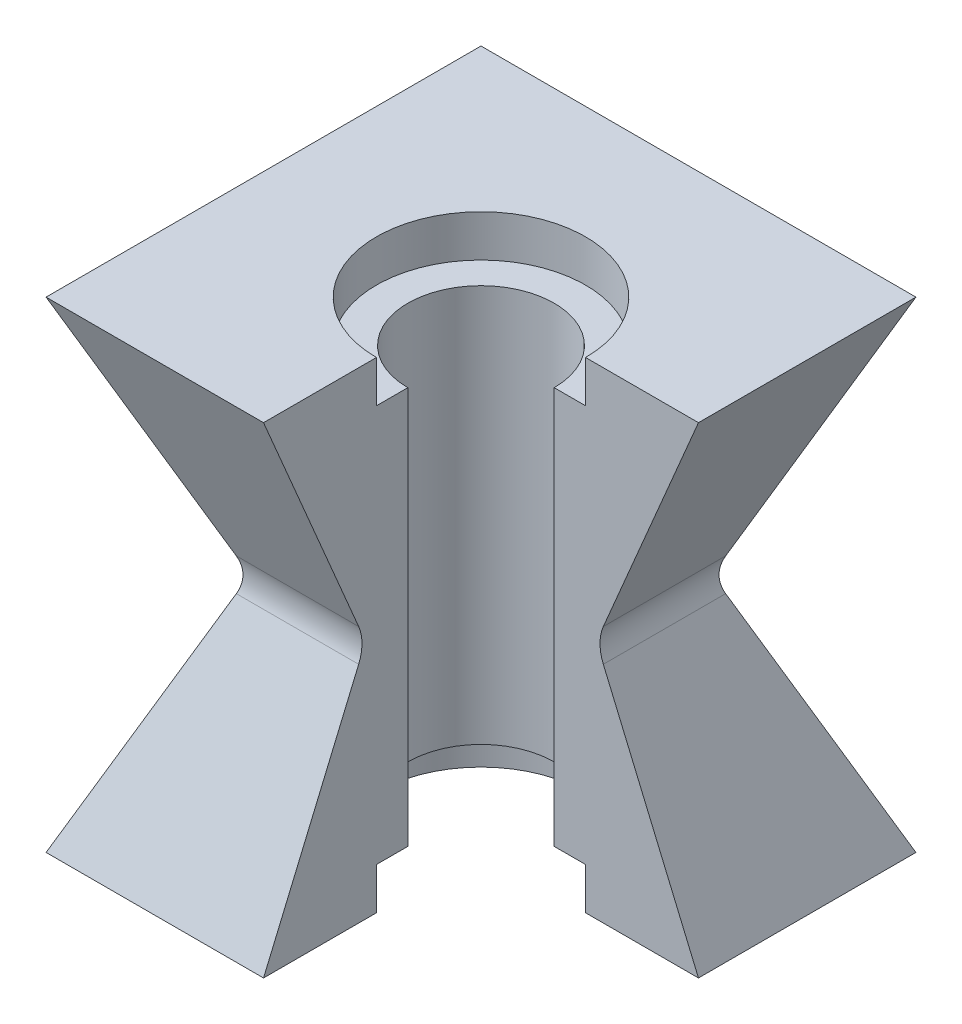
ISO-10303-21;
HEADER;
FILE_DESCRIPTION(('STEP AP214'),'2;1');
FILE_NAME('part.step','',(''),(''),'','','');
FILE_SCHEMA(('AUTOMOTIVE_DESIGN { 1 0 10303 214 1 1 1 1 }'));
ENDSEC;
DATA;
#1=APPLICATION_CONTEXT('core data for automotive mechanical design processes');
#2=APPLICATION_PROTOCOL_DEFINITION('international standard','automotive_design',2000,#1);
#3=PRODUCT_CONTEXT('',#1,'mechanical');
#4=PRODUCT('Part','Part','',(#3));
#5=PRODUCT_RELATED_PRODUCT_CATEGORY('part','',(#4));
#6=PRODUCT_DEFINITION_FORMATION('','',#4);
#7=PRODUCT_DEFINITION_CONTEXT('part definition',#1,'design');
#8=PRODUCT_DEFINITION('design','',#6,#7);
#9=PRODUCT_DEFINITION_SHAPE('','',#8);
#10=(LENGTH_UNIT() NAMED_UNIT(*) SI_UNIT(.MILLI.,.METRE.));
#11=(NAMED_UNIT(*) PLANE_ANGLE_UNIT() SI_UNIT($,.RADIAN.));
#12=(NAMED_UNIT(*) SI_UNIT($,.STERADIAN.) SOLID_ANGLE_UNIT());
#13=UNCERTAINTY_MEASURE_WITH_UNIT(LENGTH_MEASURE(1.E-05),#10,'distance_accuracy_value','');
#14=(GEOMETRIC_REPRESENTATION_CONTEXT(3) GLOBAL_UNCERTAINTY_ASSIGNED_CONTEXT((#13)) GLOBAL_UNIT_ASSIGNED_CONTEXT((#10,
#11,#12)) REPRESENTATION_CONTEXT('',''));
#15=CARTESIAN_POINT('',(0.,0.,0.));
#16=DIRECTION('',(0.,0.,1.));
#17=DIRECTION('',(1.,0.,0.));
#18=AXIS2_PLACEMENT_3D('',#15,#16,#17);
#19=CARTESIAN_POINT('',(0.,57.5,-13.5436981579994));
#20=DIRECTION('',(-1.,0.,0.));
#21=DIRECTION('',(0.,0.,1.));
#22=AXIS2_PLACEMENT_3D('',#19,#20,#21);
#23=CYLINDRICAL_SURFACE('',#22,10.);
#24=DIRECTION('',(-1.,0.,0.));
#25=VECTOR('',#24,1.);
#26=CARTESIAN_POINT('',(0.,61.4073112848927,-22.7487466925238));
#27=LINE('',#26,#25);
#28=CARTESIAN_POINT('',(22.7487466925238,61.4073112848927,-22.7487466925238));
#29=VERTEX_POINT('',#28);
#30=CARTESIAN_POINT('',(52.,61.4073112848927,-22.7487466925238));
#31=VERTEX_POINT('',#30);
#32=EDGE_CURVE('E253',#29,#31,#27,.F.);
#33=ORIENTED_EDGE('',*,*,#32,.F.);
#34=CARTESIAN_POINT('',(13.5436981579994,57.5,-13.5436981579994));
#35=DIRECTION('',(-0.707106781186548,0.,-0.707106781186547));
#36=DIRECTION('',(0.707106781186547,0.,-0.707106781186548));
#37=AXIS2_PLACEMENT_3D('',#34,#35,#36);
#38=ELLIPSE('',#37,14.1421356237309,10.);
#39=CARTESIAN_POINT('',(22.7487466925238,53.5926887151073,-22.7487466925238));
#40=VERTEX_POINT('',#39);
#41=EDGE_CURVE('E50',#29,#40,#38,.T.);
#42=ORIENTED_EDGE('',*,*,#41,.T.);
#43=DIRECTION('',(-1.,0.,0.));
#44=VECTOR('',#43,1.);
#45=CARTESIAN_POINT('',(0.,53.5926887151073,-22.7487466925238));
#46=LINE('',#45,#44);
#47=CARTESIAN_POINT('',(52.,53.5926887151073,-22.7487466925238));
#48=VERTEX_POINT('',#47);
#49=EDGE_CURVE('E257',#48,#40,#46,.T.);
#50=ORIENTED_EDGE('',*,*,#49,.F.);
#51=CARTESIAN_POINT('',(52.,57.5,-13.5436981579994));
#52=DIRECTION('',(-1.,0.,0.));
#53=DIRECTION('',(0.,0.,1.));
#54=AXIS2_PLACEMENT_3D('',#51,#52,#53);
#55=CIRCLE('',#54,10.);
#56=EDGE_CURVE('E11',#48,#31,#55,.F.);
#57=ORIENTED_EDGE('',*,*,#56,.T.);
#58=EDGE_LOOP('',(#33,#42,#50,#57));
#59=FACE_BOUND('',#58,.T.);
#60=ADVANCED_FACE('F42',(#59),#23,.F.);
#61=CARTESIAN_POINT('',(13.5436981579994,57.5,0.));
#62=DIRECTION('',(0.,0.,-1.));
#63=DIRECTION('',(-1.,0.,0.));
#64=AXIS2_PLACEMENT_3D('',#61,#62,#63);
#65=CYLINDRICAL_SURFACE('',#64,10.);
#66=DIRECTION('',(0.,0.,-1.));
#67=VECTOR('',#66,1.);
#68=CARTESIAN_POINT('',(22.7487466925238,61.4073112848927,0.));
#69=LINE('',#68,#67);
#70=CARTESIAN_POINT('',(22.7487466925237,61.4073112848928,-81.2512533074762));
#71=VERTEX_POINT('',#70);
#72=EDGE_CURVE('E244',#71,#29,#69,.F.);
#73=ORIENTED_EDGE('',*,*,#72,.F.);
#74=CARTESIAN_POINT('',(13.5436981579994,57.5,-90.4563018420006));
#75=DIRECTION('',(0.707106781186547,0.,-0.707106781186548));
#76=DIRECTION('',(0.707106781186548,0.,0.707106781186547));
#77=AXIS2_PLACEMENT_3D('',#74,#75,#76);
#78=ELLIPSE('',#77,14.142135623731,10.);
#79=CARTESIAN_POINT('',(22.7487466925238,53.5926887151073,-81.2512533074762));
#80=VERTEX_POINT('',#79);
#81=EDGE_CURVE('E250',#71,#80,#78,.T.);
#82=ORIENTED_EDGE('',*,*,#81,.T.);
#83=DIRECTION('',(0.,0.,-1.));
#84=VECTOR('',#83,1.);
#85=CARTESIAN_POINT('',(22.7487466925238,53.5926887151073,0.));
#86=LINE('',#85,#84);
#87=EDGE_CURVE('E57',#40,#80,#86,.T.);
#88=ORIENTED_EDGE('',*,*,#87,.F.);
#89=ORIENTED_EDGE('',*,*,#41,.F.);
#90=EDGE_LOOP('',(#73,#82,#88,#89));
#91=FACE_BOUND('',#90,.T.);
#92=ADVANCED_FACE('F407',(#91),#65,.F.);
#93=CARTESIAN_POINT('',(0.,57.5,-90.4563018420006));
#94=DIRECTION('',(1.,0.,0.));
#95=DIRECTION('',(0.,0.,-1.));
#96=AXIS2_PLACEMENT_3D('',#93,#94,#95);
#97=CYLINDRICAL_SURFACE('',#96,10.);
#98=DIRECTION('',(1.,0.,0.));
#99=VECTOR('',#98,1.);
#100=CARTESIAN_POINT('',(0.,61.4073112848927,-81.2512533074762));
#101=LINE('',#100,#99);
#102=CARTESIAN_POINT('',(81.2512533074762,61.4073112848928,-81.2512533074762));
#103=VERTEX_POINT('',#102);
#104=EDGE_CURVE('E232',#103,#71,#101,.F.);
#105=ORIENTED_EDGE('',*,*,#104,.F.);
#106=CARTESIAN_POINT('',(90.4563018420006,57.5,-90.4563018420006));
#107=DIRECTION('',(0.707106781186548,0.,0.707106781186547));
#108=DIRECTION('',(-0.707106781186547,0.,0.707106781186548));
#109=AXIS2_PLACEMENT_3D('',#106,#107,#108);
#110=ELLIPSE('',#109,14.1421356237309,10.);
#111=CARTESIAN_POINT('',(81.2512533074762,53.5926887151073,-81.2512533074762));
#112=VERTEX_POINT('',#111);
#113=EDGE_CURVE('E240',#103,#112,#110,.T.);
#114=ORIENTED_EDGE('',*,*,#113,.T.);
#115=DIRECTION('',(1.,0.,0.));
#116=VECTOR('',#115,1.);
#117=CARTESIAN_POINT('',(0.,53.5926887151073,-81.2512533074762));
#118=LINE('',#117,#116);
#119=EDGE_CURVE('E236',#80,#112,#118,.T.);
#120=ORIENTED_EDGE('',*,*,#119,.F.);
#121=ORIENTED_EDGE('',*,*,#81,.F.);
#122=EDGE_LOOP('',(#105,#114,#120,#121));
#123=FACE_BOUND('',#122,.T.);
#124=ADVANCED_FACE('F411',(#123),#97,.F.);
#125=CARTESIAN_POINT('',(90.4563018420006,57.5,0.));
#126=DIRECTION('',(0.,0.,1.));
#127=DIRECTION('',(1.,0.,0.));
#128=AXIS2_PLACEMENT_3D('',#125,#126,#127);
#129=CYLINDRICAL_SURFACE('',#128,10.);
#130=DIRECTION('',(0.,0.,1.));
#131=VECTOR('',#130,1.);
#132=CARTESIAN_POINT('',(81.2512533074762,61.4073112848927,0.));
#133=LINE('',#132,#131);
#134=CARTESIAN_POINT('',(81.2512533074762,61.4073112848927,-52.));
#135=VERTEX_POINT('',#134);
#136=EDGE_CURVE('E221',#135,#103,#133,.F.);
#137=ORIENTED_EDGE('',*,*,#136,.F.);
#138=CARTESIAN_POINT('',(90.4563018420006,57.5,-52.));
#139=DIRECTION('',(0.,0.,-1.));
#140=DIRECTION('',(-1.,0.,0.));
#141=AXIS2_PLACEMENT_3D('',#138,#139,#140);
#142=CIRCLE('',#141,10.);
#143=CARTESIAN_POINT('',(81.2512533074762,53.5926887151073,-52.));
#144=VERTEX_POINT('',#143);
#145=EDGE_CURVE('E229',#135,#144,#142,.F.);
#146=ORIENTED_EDGE('',*,*,#145,.T.);
#147=DIRECTION('',(0.,0.,1.));
#148=VECTOR('',#147,1.);
#149=CARTESIAN_POINT('',(81.2512533074762,53.5926887151073,0.));
#150=LINE('',#149,#148);
#151=EDGE_CURVE('E225',#112,#144,#150,.T.);
#152=ORIENTED_EDGE('',*,*,#151,.F.);
#153=ORIENTED_EDGE('',*,*,#113,.F.);
#154=EDGE_LOOP('',(#137,#146,#152,#153));
#155=FACE_BOUND('',#154,.T.);
#156=ADVANCED_FACE('F415',(#155),#129,.F.);
#157=CARTESIAN_POINT('',(52.,0.,-52.));
#158=DIRECTION('',(0.,1.,0.));
#159=DIRECTION('',(0.,0.,1.));
#160=AXIS2_PLACEMENT_3D('',#157,#158,#159);
#161=CYLINDRICAL_SURFACE('',#160,17.5);
#162=CARTESIAN_POINT('',(52.,105.,-52.));
#163=DIRECTION('',(0.,1.,0.));
#164=DIRECTION('',(0.,0.,1.));
#165=AXIS2_PLACEMENT_3D('',#162,#163,#164);
#166=CIRCLE('',#165,17.5);
#167=CARTESIAN_POINT('',(69.5,105.,-52.));
#168=VERTEX_POINT('',#167);
#169=CARTESIAN_POINT('',(52.,105.,-34.5));
#170=VERTEX_POINT('',#169);
#171=EDGE_CURVE('E205',#168,#170,#166,.T.);
#172=ORIENTED_EDGE('',*,*,#171,.T.);
#173=DIRECTION('',(0.,1.,0.));
#174=VECTOR('',#173,1.);
#175=CARTESIAN_POINT('',(52.,0.,-34.5));
#176=LINE('',#175,#174);
#177=CARTESIAN_POINT('',(52.,10.,-34.5));
#178=VERTEX_POINT('',#177);
#179=EDGE_CURVE('E310',#170,#178,#176,.F.);
#180=ORIENTED_EDGE('',*,*,#179,.T.);
#181=CARTESIAN_POINT('',(52.,10.,-52.));
#182=DIRECTION('',(0.,-1.,0.));
#183=DIRECTION('',(0.,0.,-1.));
#184=AXIS2_PLACEMENT_3D('',#181,#182,#183);
#185=CIRCLE('',#184,17.5);
#186=CARTESIAN_POINT('',(69.5,10.,-52.));
#187=VERTEX_POINT('',#186);
#188=EDGE_CURVE('E210',#187,#178,#185,.F.);
#189=ORIENTED_EDGE('',*,*,#188,.F.);
#190=DIRECTION('',(0.,1.,0.));
#191=VECTOR('',#190,1.);
#192=CARTESIAN_POINT('',(69.5,0.,-52.));
#193=LINE('',#192,#191);
#194=EDGE_CURVE('E286',#187,#168,#193,.T.);
#195=ORIENTED_EDGE('',*,*,#194,.T.);
#196=EDGE_LOOP('',(#172,#180,#189,#195));
#197=FACE_BOUND('',#196,.T.);
#198=ADVANCED_FACE('F390',(#197),#161,.F.);
#199=CARTESIAN_POINT('',(0.,0.,0.));
#200=DIRECTION('',(-0.92050485345244,0.390731128489275,0.));
#201=DIRECTION('',(-0.390731128489275,-0.92050485345244,0.));
#202=AXIS2_PLACEMENT_3D('',#199,#200,#201);
#203=PLANE('',#202);
#204=DIRECTION('',(-0.363936289648103,-0.8573801689766,0.363936289648103));
#205=VECTOR('',#204,1.);
#206=CARTESIAN_POINT('',(0.,0.,0.));
#207=LINE('',#206,#205);
#208=CARTESIAN_POINT('',(0.,0.,0.));
#209=VERTEX_POINT('',#208);
#210=EDGE_CURVE('E179',#40,#209,#207,.T.);
#211=ORIENTED_EDGE('',*,*,#210,.F.);
#212=ORIENTED_EDGE('',*,*,#87,.T.);
#213=DIRECTION('',(-0.363936289648103,-0.8573801689766,-0.363936289648103));
#214=VECTOR('',#213,1.);
#215=CARTESIAN_POINT('',(13.7747607839741,32.4513027815816,-90.2252392160259));
#216=LINE('',#215,#214);
#217=CARTESIAN_POINT('',(0.,0.,-104.));
#218=VERTEX_POINT('',#217);
#219=EDGE_CURVE('E196',#80,#218,#216,.T.);
#220=ORIENTED_EDGE('',*,*,#219,.T.);
#221=DIRECTION('',(0.,0.,1.));
#222=VECTOR('',#221,1.);
#223=CARTESIAN_POINT('',(0.,0.,0.));
#224=LINE('',#223,#222);
#225=EDGE_CURVE('E182',#218,#209,#224,.T.);
#226=ORIENTED_EDGE('',*,*,#225,.T.);
#227=EDGE_LOOP('',(#211,#212,#220,#226));
#228=FACE_BOUND('',#227,.T.);
#229=ADVANCED_FACE('F264',(#228),#203,.T.);
#230=CARTESIAN_POINT('',(0.,0.,0.));
#231=DIRECTION('',(0.,0.390731128489275,0.92050485345244));
#232=DIRECTION('',(0.,-0.92050485345244,0.390731128489275));
#233=AXIS2_PLACEMENT_3D('',#230,#231,#232);
#234=PLANE('',#233);
#235=DIRECTION('',(0.,-0.92050485345244,0.390731128489275));
#236=VECTOR('',#235,1.);
#237=CARTESIAN_POINT('',(52.,0.,0.));
#238=LINE('',#237,#236);
#239=CARTESIAN_POINT('',(52.,0.,0.));
#240=VERTEX_POINT('',#239);
#241=EDGE_CURVE('E152',#240,#48,#238,.F.);
#242=ORIENTED_EDGE('',*,*,#241,.T.);
#243=ORIENTED_EDGE('',*,*,#49,.T.);
#244=ORIENTED_EDGE('',*,*,#210,.T.);
#245=DIRECTION('',(1.,0.,0.));
#246=VECTOR('',#245,1.);
#247=CARTESIAN_POINT('',(0.,0.,0.));
#248=LINE('',#247,#246);
#249=EDGE_CURVE('E169',#209,#240,#248,.T.);
#250=ORIENTED_EDGE('',*,*,#249,.T.);
#251=EDGE_LOOP('',(#242,#243,#244,#250));
#252=FACE_BOUND('',#251,.T.);
#253=ADVANCED_FACE('F177',(#252),#234,.T.);
#254=CARTESIAN_POINT('',(104.,0.,0.));
#255=DIRECTION('',(0.92050485345244,0.390731128489275,0.));
#256=DIRECTION('',(-0.390731128489275,0.92050485345244,0.));
#257=AXIS2_PLACEMENT_3D('',#254,#255,#256);
#258=PLANE('',#257);
#259=DIRECTION('',(0.363936289648103,-0.8573801689766,-0.363936289648103));
#260=VECTOR('',#259,1.);
#261=CARTESIAN_POINT('',(90.2252392160259,32.4513027815816,-90.2252392160259));
#262=LINE('',#261,#260);
#263=CARTESIAN_POINT('',(104.,0.,-104.));
#264=VERTEX_POINT('',#263);
#265=EDGE_CURVE('E200',#112,#264,#262,.T.);
#266=ORIENTED_EDGE('',*,*,#265,.F.);
#267=ORIENTED_EDGE('',*,*,#151,.T.);
#268=DIRECTION('',(-0.390731128489275,0.92050485345244,0.));
#269=VECTOR('',#268,1.);
#270=CARTESIAN_POINT('',(104.,0.,-52.));
#271=LINE('',#270,#269);
#272=CARTESIAN_POINT('',(104.,0.,-52.));
#273=VERTEX_POINT('',#272);
#274=EDGE_CURVE('E274',#144,#273,#271,.F.);
#275=ORIENTED_EDGE('',*,*,#274,.T.);
#276=DIRECTION('',(0.,0.,-1.));
#277=VECTOR('',#276,1.);
#278=CARTESIAN_POINT('',(104.,0.,0.));
#279=LINE('',#278,#277);
#280=EDGE_CURVE('E181',#273,#264,#279,.T.);
#281=ORIENTED_EDGE('',*,*,#280,.T.);
#282=EDGE_LOOP('',(#266,#267,#275,#281));
#283=FACE_BOUND('',#282,.T.);
#284=ADVANCED_FACE('F272',(#283),#258,.T.);
#285=CARTESIAN_POINT('',(0.,0.,-104.));
#286=DIRECTION('',(0.,0.390731128489275,-0.92050485345244));
#287=DIRECTION('',(0.,0.92050485345244,0.390731128489275));
#288=AXIS2_PLACEMENT_3D('',#285,#286,#287);
#289=PLANE('',#288);
#290=ORIENTED_EDGE('',*,*,#219,.F.);
#291=ORIENTED_EDGE('',*,*,#119,.T.);
#292=ORIENTED_EDGE('',*,*,#265,.T.);
#293=DIRECTION('',(-1.,0.,0.));
#294=VECTOR('',#293,1.);
#295=CARTESIAN_POINT('',(0.,0.,-104.));
#296=LINE('',#295,#294);
#297=EDGE_CURVE('E187',#264,#218,#296,.T.);
#298=ORIENTED_EDGE('',*,*,#297,.T.);
#299=EDGE_LOOP('',(#290,#291,#292,#298));
#300=FACE_BOUND('',#299,.T.);
#301=ADVANCED_FACE('F269',(#300),#289,.T.);
#302=CARTESIAN_POINT('',(0.,0.,0.));
#303=DIRECTION('',(0.,-1.,0.));
#304=DIRECTION('',(0.,0.,-1.));
#305=AXIS2_PLACEMENT_3D('',#302,#303,#304);
#306=PLANE('',#305);
#307=DIRECTION('',(0.,0.,1.));
#308=VECTOR('',#307,1.);
#309=CARTESIAN_POINT('',(52.,0.,-52.));
#310=LINE('',#309,#308);
#311=CARTESIAN_POINT('',(52.,0.,-27.));
#312=VERTEX_POINT('',#311);
#313=EDGE_CURVE('E155',#312,#240,#310,.T.);
#314=ORIENTED_EDGE('',*,*,#313,.T.);
#315=ORIENTED_EDGE('',*,*,#249,.F.);
#316=ORIENTED_EDGE('',*,*,#225,.F.);
#317=ORIENTED_EDGE('',*,*,#297,.F.);
#318=ORIENTED_EDGE('',*,*,#280,.F.);
#319=DIRECTION('',(-1.,0.,0.));
#320=VECTOR('',#319,1.);
#321=CARTESIAN_POINT('',(52.,0.,-52.));
#322=LINE('',#321,#320);
#323=CARTESIAN_POINT('',(77.,0.,-52.));
#324=VERTEX_POINT('',#323);
#325=EDGE_CURVE('E174',#273,#324,#322,.T.);
#326=ORIENTED_EDGE('',*,*,#325,.T.);
#327=CARTESIAN_POINT('',(52.,0.,-52.));
#328=DIRECTION('',(0.,-1.,0.));
#329=DIRECTION('',(0.,0.,-1.));
#330=AXIS2_PLACEMENT_3D('',#327,#328,#329);
#331=CIRCLE('',#330,25.);
#332=EDGE_CURVE('E161',#312,#324,#331,.T.);
#333=ORIENTED_EDGE('',*,*,#332,.F.);
#334=EDGE_LOOP('',(#314,#315,#316,#317,#318,#326,#333));
#335=FACE_BOUND('',#334,.T.);
#336=ADVANCED_FACE('F167',(#335),#306,.T.);
#337=CARTESIAN_POINT('',(0.,115.,0.));
#338=DIRECTION('',(-0.92050485345244,-0.390731128489275,0.));
#339=DIRECTION('',(-0.390731128489275,0.92050485345244,0.));
#340=AXIS2_PLACEMENT_3D('',#337,#338,#339);
#341=PLANE('',#340);
#342=DIRECTION('',(-0.363936289648103,0.8573801689766,-0.363936289648103));
#343=VECTOR('',#342,1.);
#344=CARTESIAN_POINT('',(13.7747607839741,82.5486972184184,-90.2252392160259));
#345=LINE('',#344,#343);
#346=CARTESIAN_POINT('',(0.,115.,-104.));
#347=VERTEX_POINT('',#346);
#348=EDGE_CURVE('E351',#71,#347,#345,.T.);
#349=ORIENTED_EDGE('',*,*,#348,.F.);
#350=ORIENTED_EDGE('',*,*,#72,.T.);
#351=DIRECTION('',(-0.363936289648103,0.8573801689766,0.363936289648103));
#352=VECTOR('',#351,1.);
#353=CARTESIAN_POINT('',(0.,115.,0.));
#354=LINE('',#353,#352);
#355=CARTESIAN_POINT('',(0.,115.,0.));
#356=VERTEX_POINT('',#355);
#357=EDGE_CURVE('E189',#29,#356,#354,.T.);
#358=ORIENTED_EDGE('',*,*,#357,.T.);
#359=DIRECTION('',(0.,0.,1.));
#360=VECTOR('',#359,1.);
#361=CARTESIAN_POINT('',(0.,115.,0.));
#362=LINE('',#361,#360);
#363=EDGE_CURVE('E332',#347,#356,#362,.T.);
#364=ORIENTED_EDGE('',*,*,#363,.F.);
#365=EDGE_LOOP('',(#349,#350,#358,#364));
#366=FACE_BOUND('',#365,.T.);
#367=ADVANCED_FACE('F374',(#366),#341,.T.);
#368=CARTESIAN_POINT('',(0.,115.,0.));
#369=DIRECTION('',(0.,-0.390731128489275,0.92050485345244));
#370=DIRECTION('',(0.,0.92050485345244,0.390731128489275));
#371=AXIS2_PLACEMENT_3D('',#368,#369,#370);
#372=PLANE('',#371);
#373=ORIENTED_EDGE('',*,*,#357,.F.);
#374=ORIENTED_EDGE('',*,*,#32,.T.);
#375=DIRECTION('',(0.,-0.92050485345244,-0.390731128489275));
#376=VECTOR('',#375,1.);
#377=CARTESIAN_POINT('',(52.,115.,0.));
#378=LINE('',#377,#376);
#379=CARTESIAN_POINT('',(52.,115.,0.));
#380=VERTEX_POINT('',#379);
#381=EDGE_CURVE('E162',#31,#380,#378,.F.);
#382=ORIENTED_EDGE('',*,*,#381,.T.);
#383=DIRECTION('',(1.,0.,0.));
#384=VECTOR('',#383,1.);
#385=CARTESIAN_POINT('',(0.,115.,0.));
#386=LINE('',#385,#384);
#387=EDGE_CURVE('E339',#356,#380,#386,.T.);
#388=ORIENTED_EDGE('',*,*,#387,.F.);
#389=EDGE_LOOP('',(#373,#374,#382,#388));
#390=FACE_BOUND('',#389,.T.);
#391=ADVANCED_FACE('F378',(#390),#372,.T.);
#392=CARTESIAN_POINT('',(104.,115.,0.));
#393=DIRECTION('',(0.92050485345244,-0.390731128489275,0.));
#394=DIRECTION('',(-0.390731128489275,-0.92050485345244,0.));
#395=AXIS2_PLACEMENT_3D('',#392,#393,#394);
#396=PLANE('',#395);
#397=DIRECTION('',(0.390731128489275,0.92050485345244,0.));
#398=VECTOR('',#397,1.);
#399=CARTESIAN_POINT('',(104.,115.,-52.));
#400=LINE('',#399,#398);
#401=CARTESIAN_POINT('',(104.,115.,-52.));
#402=VERTEX_POINT('',#401);
#403=EDGE_CURVE('E279',#402,#135,#400,.F.);
#404=ORIENTED_EDGE('',*,*,#403,.T.);
#405=ORIENTED_EDGE('',*,*,#136,.T.);
#406=DIRECTION('',(0.363936289648103,0.8573801689766,-0.363936289648103));
#407=VECTOR('',#406,1.);
#408=CARTESIAN_POINT('',(90.2252392160259,82.5486972184184,-90.2252392160259));
#409=LINE('',#408,#407);
#410=CARTESIAN_POINT('',(104.,115.,-104.));
#411=VERTEX_POINT('',#410);
#412=EDGE_CURVE('E354',#103,#411,#409,.T.);
#413=ORIENTED_EDGE('',*,*,#412,.T.);
#414=DIRECTION('',(0.,0.,-1.));
#415=VECTOR('',#414,1.);
#416=CARTESIAN_POINT('',(104.,115.,0.));
#417=LINE('',#416,#415);
#418=EDGE_CURVE('E343',#402,#411,#417,.T.);
#419=ORIENTED_EDGE('',*,*,#418,.F.);
#420=EDGE_LOOP('',(#404,#405,#413,#419));
#421=FACE_BOUND('',#420,.T.);
#422=ADVANCED_FACE('F360',(#421),#396,.T.);
#423=CARTESIAN_POINT('',(0.,115.,-104.));
#424=DIRECTION('',(0.,-0.390731128489275,-0.92050485345244));
#425=DIRECTION('',(0.,-0.92050485345244,0.390731128489275));
#426=AXIS2_PLACEMENT_3D('',#423,#424,#425);
#427=PLANE('',#426);
#428=ORIENTED_EDGE('',*,*,#412,.F.);
#429=ORIENTED_EDGE('',*,*,#104,.T.);
#430=ORIENTED_EDGE('',*,*,#348,.T.);
#431=DIRECTION('',(-1.,0.,0.));
#432=VECTOR('',#431,1.);
#433=CARTESIAN_POINT('',(0.,115.,-104.));
#434=LINE('',#433,#432);
#435=EDGE_CURVE('E347',#411,#347,#434,.T.);
#436=ORIENTED_EDGE('',*,*,#435,.F.);
#437=EDGE_LOOP('',(#428,#429,#430,#436));
#438=FACE_BOUND('',#437,.T.);
#439=ADVANCED_FACE('F370',(#438),#427,.T.);
#440=CARTESIAN_POINT('',(0.,115.,0.));
#441=DIRECTION('',(0.,1.,0.));
#442=DIRECTION('',(0.,0.,-1.));
#443=AXIS2_PLACEMENT_3D('',#440,#441,#442);
#444=PLANE('',#443);
#445=DIRECTION('',(0.,0.,1.));
#446=VECTOR('',#445,1.);
#447=CARTESIAN_POINT('',(52.,115.,-52.));
#448=LINE('',#447,#446);
#449=CARTESIAN_POINT('',(52.,115.,-27.));
#450=VERTEX_POINT('',#449);
#451=EDGE_CURVE('E289',#450,#380,#448,.T.);
#452=ORIENTED_EDGE('',*,*,#451,.F.);
#453=CARTESIAN_POINT('',(52.,115.,-52.));
#454=DIRECTION('',(0.,1.,0.));
#455=DIRECTION('',(0.,0.,1.));
#456=AXIS2_PLACEMENT_3D('',#453,#454,#455);
#457=CIRCLE('',#456,25.);
#458=CARTESIAN_POINT('',(77.,115.,-52.));
#459=VERTEX_POINT('',#458);
#460=EDGE_CURVE('E209',#459,#450,#457,.T.);
#461=ORIENTED_EDGE('',*,*,#460,.F.);
#462=DIRECTION('',(-1.,0.,0.));
#463=VECTOR('',#462,1.);
#464=CARTESIAN_POINT('',(52.,115.,-52.));
#465=LINE('',#464,#463);
#466=EDGE_CURVE('E175',#402,#459,#465,.T.);
#467=ORIENTED_EDGE('',*,*,#466,.F.);
#468=ORIENTED_EDGE('',*,*,#418,.T.);
#469=ORIENTED_EDGE('',*,*,#435,.T.);
#470=ORIENTED_EDGE('',*,*,#363,.T.);
#471=ORIENTED_EDGE('',*,*,#387,.T.);
#472=EDGE_LOOP('',(#452,#461,#467,#468,#469,#470,#471));
#473=FACE_BOUND('',#472,.T.);
#474=ADVANCED_FACE('F367',(#473),#444,.T.);
#475=CARTESIAN_POINT('',(52.,105.,-52.));
#476=DIRECTION('',(0.,1.,0.));
#477=DIRECTION('',(0.,0.,1.));
#478=AXIS2_PLACEMENT_3D('',#475,#476,#477);
#479=CYLINDRICAL_SURFACE('',#478,25.);
#480=ORIENTED_EDGE('',*,*,#460,.T.);
#481=DIRECTION('',(0.,1.,0.));
#482=VECTOR('',#481,1.);
#483=CARTESIAN_POINT('',(52.,105.,-27.));
#484=LINE('',#483,#482);
#485=CARTESIAN_POINT('',(52.,105.,-27.));
#486=VERTEX_POINT('',#485);
#487=EDGE_CURVE('E317',#450,#486,#484,.F.);
#488=ORIENTED_EDGE('',*,*,#487,.T.);
#489=CARTESIAN_POINT('',(52.,105.,-52.));
#490=DIRECTION('',(0.,1.,0.));
#491=DIRECTION('',(0.,0.,1.));
#492=AXIS2_PLACEMENT_3D('',#489,#490,#491);
#493=CIRCLE('',#492,25.);
#494=CARTESIAN_POINT('',(77.,105.,-52.));
#495=VERTEX_POINT('',#494);
#496=EDGE_CURVE('E328',#495,#486,#493,.T.);
#497=ORIENTED_EDGE('',*,*,#496,.F.);
#498=DIRECTION('',(0.,1.,0.));
#499=VECTOR('',#498,1.);
#500=CARTESIAN_POINT('',(77.,105.,-52.));
#501=LINE('',#500,#499);
#502=EDGE_CURVE('E301',#495,#459,#501,.T.);
#503=ORIENTED_EDGE('',*,*,#502,.T.);
#504=EDGE_LOOP('',(#480,#488,#497,#503));
#505=FACE_BOUND('',#504,.T.);
#506=ADVANCED_FACE('F382',(#505),#479,.F.);
#507=CARTESIAN_POINT('',(52.,105.,-52.));
#508=DIRECTION('',(0.,1.,0.));
#509=DIRECTION('',(0.,0.,1.));
#510=AXIS2_PLACEMENT_3D('',#507,#508,#509);
#511=PLANE('',#510);
#512=DIRECTION('',(0.,0.,1.));
#513=VECTOR('',#512,1.);
#514=CARTESIAN_POINT('',(52.,105.,-52.));
#515=LINE('',#514,#513);
#516=EDGE_CURVE('E314',#170,#486,#515,.T.);
#517=ORIENTED_EDGE('',*,*,#516,.F.);
#518=ORIENTED_EDGE('',*,*,#171,.F.);
#519=DIRECTION('',(-1.,0.,0.));
#520=VECTOR('',#519,1.);
#521=CARTESIAN_POINT('',(52.,105.,-52.));
#522=LINE('',#521,#520);
#523=EDGE_CURVE('E298',#495,#168,#522,.T.);
#524=ORIENTED_EDGE('',*,*,#523,.F.);
#525=ORIENTED_EDGE('',*,*,#496,.T.);
#526=EDGE_LOOP('',(#517,#518,#524,#525));
#527=FACE_BOUND('',#526,.T.);
#528=ADVANCED_FACE('F385',(#527),#511,.T.);
#529=CARTESIAN_POINT('',(52.,10.,-52.));
#530=DIRECTION('',(0.,-1.,0.));
#531=DIRECTION('',(0.,0.,-1.));
#532=AXIS2_PLACEMENT_3D('',#529,#530,#531);
#533=PLANE('',#532);
#534=DIRECTION('',(0.,0.,-1.));
#535=VECTOR('',#534,1.);
#536=CARTESIAN_POINT('',(52.,10.,-52.));
#537=LINE('',#536,#535);
#538=CARTESIAN_POINT('',(52.,10.,-27.));
#539=VERTEX_POINT('',#538);
#540=EDGE_CURVE('E278',#539,#178,#537,.T.);
#541=ORIENTED_EDGE('',*,*,#540,.F.);
#542=CARTESIAN_POINT('',(52.,10.,-52.));
#543=DIRECTION('',(0.,-1.,0.));
#544=DIRECTION('',(0.,0.,-1.));
#545=AXIS2_PLACEMENT_3D('',#542,#543,#544);
#546=CIRCLE('',#545,25.);
#547=CARTESIAN_POINT('',(77.,10.,-52.));
#548=VERTEX_POINT('',#547);
#549=EDGE_CURVE('E214',#539,#548,#546,.T.);
#550=ORIENTED_EDGE('',*,*,#549,.T.);
#551=DIRECTION('',(1.,0.,0.));
#552=VECTOR('',#551,1.);
#553=CARTESIAN_POINT('',(52.,10.,-52.));
#554=LINE('',#553,#552);
#555=EDGE_CURVE('E283',#187,#548,#554,.T.);
#556=ORIENTED_EDGE('',*,*,#555,.F.);
#557=ORIENTED_EDGE('',*,*,#188,.T.);
#558=EDGE_LOOP('',(#541,#550,#556,#557));
#559=FACE_BOUND('',#558,.T.);
#560=ADVANCED_FACE('F393',(#559),#533,.T.);
#561=CARTESIAN_POINT('',(52.,10.,-52.));
#562=DIRECTION('',(0.,-1.,0.));
#563=DIRECTION('',(0.,0.,-1.));
#564=AXIS2_PLACEMENT_3D('',#561,#562,#563);
#565=CYLINDRICAL_SURFACE('',#564,25.);
#566=ORIENTED_EDGE('',*,*,#549,.F.);
#567=DIRECTION('',(0.,-1.,0.));
#568=VECTOR('',#567,1.);
#569=CARTESIAN_POINT('',(52.,10.,-27.));
#570=LINE('',#569,#568);
#571=EDGE_CURVE('E218',#539,#312,#570,.T.);
#572=ORIENTED_EDGE('',*,*,#571,.T.);
#573=ORIENTED_EDGE('',*,*,#332,.T.);
#574=DIRECTION('',(0.,-1.,0.));
#575=VECTOR('',#574,1.);
#576=CARTESIAN_POINT('',(77.,10.,-52.));
#577=LINE('',#576,#575);
#578=EDGE_CURVE('E199',#324,#548,#577,.F.);
#579=ORIENTED_EDGE('',*,*,#578,.T.);
#580=EDGE_LOOP('',(#566,#572,#573,#579));
#581=FACE_BOUND('',#580,.T.);
#582=ADVANCED_FACE('F396',(#581),#565,.F.);
#583=CARTESIAN_POINT('',(52.,0.,-52.));
#584=DIRECTION('',(0.,0.,-1.));
#585=DIRECTION('',(-1.,0.,0.));
#586=AXIS2_PLACEMENT_3D('',#583,#584,#585);
#587=PLANE('',#586);
#588=ORIENTED_EDGE('',*,*,#403,.F.);
#589=ORIENTED_EDGE('',*,*,#466,.T.);
#590=ORIENTED_EDGE('',*,*,#502,.F.);
#591=ORIENTED_EDGE('',*,*,#523,.T.);
#592=ORIENTED_EDGE('',*,*,#194,.F.);
#593=ORIENTED_EDGE('',*,*,#555,.T.);
#594=ORIENTED_EDGE('',*,*,#578,.F.);
#595=ORIENTED_EDGE('',*,*,#325,.F.);
#596=ORIENTED_EDGE('',*,*,#274,.F.);
#597=ORIENTED_EDGE('',*,*,#145,.F.);
#598=EDGE_LOOP('',(#588,#589,#590,#591,#592,#593,#594,#595,#596,#597));
#599=FACE_BOUND('',#598,.T.);
#600=ADVANCED_FACE('F281',(#599),#587,.F.);
#601=CARTESIAN_POINT('',(52.,0.,-52.));
#602=DIRECTION('',(-1.,0.,0.));
#603=DIRECTION('',(0.,0.,1.));
#604=AXIS2_PLACEMENT_3D('',#601,#602,#603);
#605=PLANE('',#604);
#606=ORIENTED_EDGE('',*,*,#313,.F.);
#607=ORIENTED_EDGE('',*,*,#571,.F.);
#608=ORIENTED_EDGE('',*,*,#540,.T.);
#609=ORIENTED_EDGE('',*,*,#179,.F.);
#610=ORIENTED_EDGE('',*,*,#516,.T.);
#611=ORIENTED_EDGE('',*,*,#487,.F.);
#612=ORIENTED_EDGE('',*,*,#451,.T.);
#613=ORIENTED_EDGE('',*,*,#381,.F.);
#614=ORIENTED_EDGE('',*,*,#56,.F.);
#615=ORIENTED_EDGE('',*,*,#241,.F.);
#616=EDGE_LOOP('',(#606,#607,#608,#609,#610,#611,#612,#613,#614,#615));
#617=FACE_BOUND('',#616,.T.);
#618=ADVANCED_FACE('F154',(#617),#605,.F.);
#619=CLOSED_SHELL('',(#60,#92,#124,#156,#198,#229,#253,#284,#301,#336,#367,#391,#422,#439,#474,
#506,#528,#560,#582,#600,#618));
#620=MANIFOLD_SOLID_BREP('B2',#619);
#621=ADVANCED_BREP_SHAPE_REPRESENTATION('',(#18,#620),#14);
#622=SHAPE_DEFINITION_REPRESENTATION(#9,#621);
ENDSEC;
END-ISO-10303-21;
